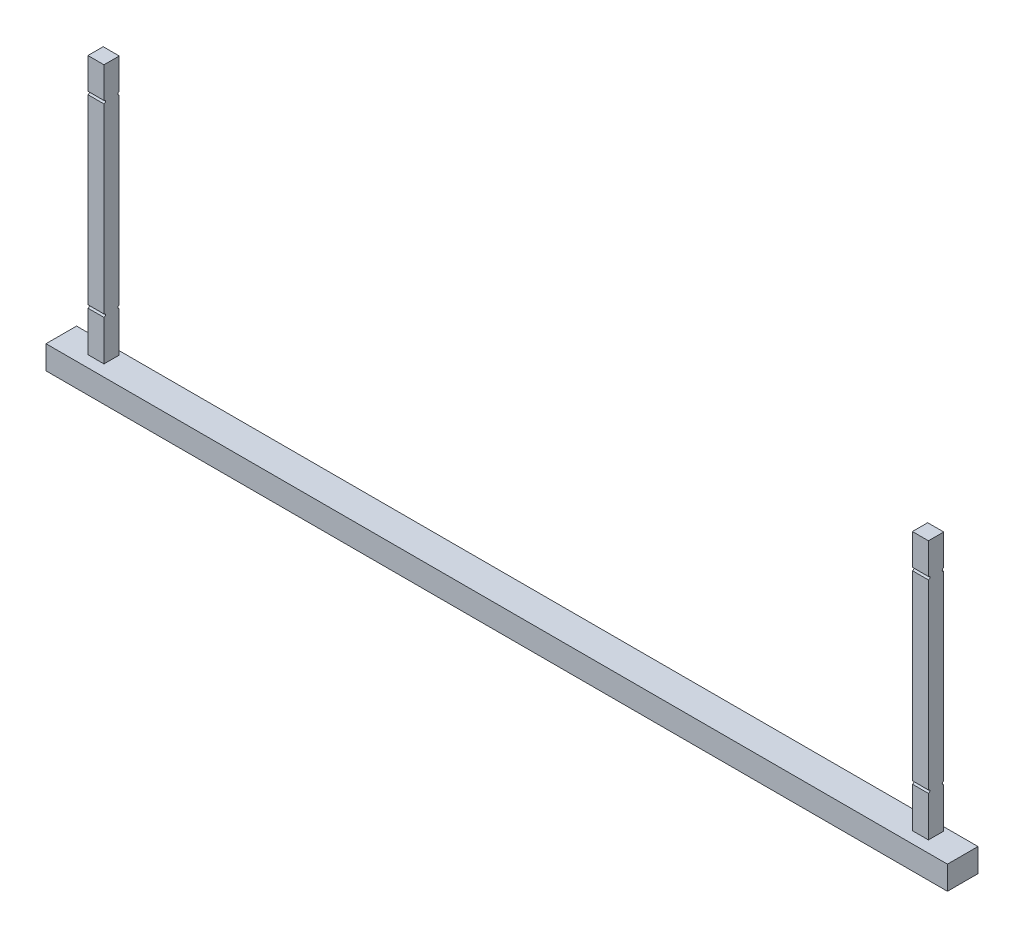
ISO-10303-21;
HEADER;
FILE_DESCRIPTION(('STEP AP214'),'2;1');
FILE_NAME('part.step','',(''),(''),'','','');
FILE_SCHEMA(('AUTOMOTIVE_DESIGN { 1 0 10303 214 1 1 1 1 }'));
ENDSEC;
DATA;
#1=APPLICATION_CONTEXT('core data for automotive mechanical design processes');
#2=APPLICATION_PROTOCOL_DEFINITION('international standard','automotive_design',2000,#1);
#3=PRODUCT_CONTEXT('',#1,'mechanical');
#4=PRODUCT('Part','Part','',(#3));
#5=PRODUCT_RELATED_PRODUCT_CATEGORY('part','',(#4));
#6=PRODUCT_DEFINITION_FORMATION('','',#4);
#7=PRODUCT_DEFINITION_CONTEXT('part definition',#1,'design');
#8=PRODUCT_DEFINITION('design','',#6,#7);
#9=PRODUCT_DEFINITION_SHAPE('','',#8);
#10=(LENGTH_UNIT() NAMED_UNIT(*) SI_UNIT(.MILLI.,.METRE.));
#11=(NAMED_UNIT(*) PLANE_ANGLE_UNIT() SI_UNIT($,.RADIAN.));
#12=(NAMED_UNIT(*) SI_UNIT($,.STERADIAN.) SOLID_ANGLE_UNIT());
#13=UNCERTAINTY_MEASURE_WITH_UNIT(LENGTH_MEASURE(1.E-05),#10,'distance_accuracy_value','');
#14=(GEOMETRIC_REPRESENTATION_CONTEXT(3) GLOBAL_UNCERTAINTY_ASSIGNED_CONTEXT((#13)) GLOBAL_UNIT_ASSIGNED_CONTEXT((#10,
#11,#12)) REPRESENTATION_CONTEXT('',''));
#15=CARTESIAN_POINT('',(0.,0.,0.));
#16=DIRECTION('',(0.,0.,1.));
#17=DIRECTION('',(1.,0.,0.));
#18=AXIS2_PLACEMENT_3D('',#15,#16,#17);
#19=CARTESIAN_POINT('',(5700.63,1849.72,125.));
#20=DIRECTION('',(0.,0.,-1.));
#21=DIRECTION('',(-1.,0.,0.));
#22=AXIS2_PLACEMENT_3D('',#19,#20,#21);
#23=PLANE('',#22);
#24=DIRECTION('',(0.,-1.,0.));
#25=VECTOR('',#24,1.);
#26=CARTESIAN_POINT('',(5595.63,1849.72,125.));
#27=LINE('',#26,#25);
#28=CARTESIAN_POINT('',(5595.63,1849.72,125.));
#29=VERTEX_POINT('',#28);
#30=CARTESIAN_POINT('',(5595.63,1647.29,125.));
#31=VERTEX_POINT('',#30);
#32=EDGE_CURVE('E235',#29,#31,#27,.T.);
#33=ORIENTED_EDGE('',*,*,#32,.T.);
#34=DIRECTION('',(1.,0.,0.));
#35=VECTOR('',#34,1.);
#36=CARTESIAN_POINT('',(5700.63,1647.29,125.));
#37=LINE('',#36,#35);
#38=CARTESIAN_POINT('',(5700.63,1647.29,125.));
#39=VERTEX_POINT('',#38);
#40=EDGE_CURVE('E221',#31,#39,#37,.T.);
#41=ORIENTED_EDGE('',*,*,#40,.T.);
#42=DIRECTION('',(0.,-1.,0.));
#43=VECTOR('',#42,1.);
#44=CARTESIAN_POINT('',(5700.63,1849.72,125.));
#45=LINE('',#44,#43);
#46=CARTESIAN_POINT('',(5700.63,1849.72,125.));
#47=VERTEX_POINT('',#46);
#48=EDGE_CURVE('E232',#47,#39,#45,.T.);
#49=ORIENTED_EDGE('',*,*,#48,.F.);
#50=DIRECTION('',(1.,0.,0.));
#51=VECTOR('',#50,1.);
#52=CARTESIAN_POINT('',(5700.63,1849.72,125.));
#53=LINE('',#52,#51);
#54=EDGE_CURVE('E265',#29,#47,#53,.T.);
#55=ORIENTED_EDGE('',*,*,#54,.F.);
#56=EDGE_LOOP('',(#33,#41,#49,#55));
#57=FACE_BOUND('',#56,.T.);
#58=ADVANCED_FACE('F37',(#57),#23,.F.);
#59=CARTESIAN_POINT('',(199.376102892229,1849.72,125.));
#60=DIRECTION('',(0.,0.,-1.));
#61=DIRECTION('',(-1.,0.,0.));
#62=AXIS2_PLACEMENT_3D('',#59,#60,#61);
#63=PLANE('',#62);
#64=DIRECTION('',(0.,-1.,0.));
#65=VECTOR('',#64,1.);
#66=CARTESIAN_POINT('',(199.376102892229,1849.72,125.));
#67=LINE('',#66,#65);
#68=CARTESIAN_POINT('',(199.376102892229,1849.72,125.));
#69=VERTEX_POINT('',#68);
#70=CARTESIAN_POINT('',(199.376102892229,1647.29,125.));
#71=VERTEX_POINT('',#70);
#72=EDGE_CURVE('E286',#69,#71,#67,.T.);
#73=ORIENTED_EDGE('',*,*,#72,.T.);
#74=DIRECTION('',(1.,0.,0.));
#75=VECTOR('',#74,1.);
#76=CARTESIAN_POINT('',(5700.63,1647.29,125.));
#77=LINE('',#76,#75);
#78=CARTESIAN_POINT('',(304.376102892229,1647.29,125.));
#79=VERTEX_POINT('',#78);
#80=EDGE_CURVE('E60',#71,#79,#77,.T.);
#81=ORIENTED_EDGE('',*,*,#80,.T.);
#82=DIRECTION('',(0.,-1.,0.));
#83=VECTOR('',#82,1.);
#84=CARTESIAN_POINT('',(304.376102892229,1849.72,125.));
#85=LINE('',#84,#83);
#86=CARTESIAN_POINT('',(304.376102892229,1849.72,125.));
#87=VERTEX_POINT('',#86);
#88=EDGE_CURVE('E291',#87,#79,#85,.T.);
#89=ORIENTED_EDGE('',*,*,#88,.F.);
#90=DIRECTION('',(1.,0.,0.));
#91=VECTOR('',#90,1.);
#92=CARTESIAN_POINT('',(199.376102892229,1849.72,125.));
#93=LINE('',#92,#91);
#94=EDGE_CURVE('E310',#69,#87,#93,.T.);
#95=ORIENTED_EDGE('',*,*,#94,.F.);
#96=EDGE_LOOP('',(#73,#81,#89,#95));
#97=FACE_BOUND('',#96,.T.);
#98=ADVANCED_FACE('F429',(#97),#63,.F.);
#99=CARTESIAN_POINT('',(5595.63,1849.72,25.));
#100=DIRECTION('',(0.,0.,1.));
#101=DIRECTION('',(1.,0.,0.));
#102=AXIS2_PLACEMENT_3D('',#99,#100,#101);
#103=PLANE('',#102);
#104=DIRECTION('',(0.,-1.,0.));
#105=VECTOR('',#104,1.);
#106=CARTESIAN_POINT('',(5595.63,1849.72,25.));
#107=LINE('',#106,#105);
#108=CARTESIAN_POINT('',(5595.63,1627.79,25.));
#109=VERTEX_POINT('',#108);
#110=CARTESIAN_POINT('',(5595.63,437.289999999999,25.));
#111=VERTEX_POINT('',#110);
#112=EDGE_CURVE('E509',#109,#111,#107,.T.);
#113=ORIENTED_EDGE('',*,*,#112,.F.);
#114=DIRECTION('',(1.,0.,0.));
#115=VECTOR('',#114,1.);
#116=CARTESIAN_POINT('',(5700.63,1627.79,25.));
#117=LINE('',#116,#115);
#118=CARTESIAN_POINT('',(5700.63,1627.79,25.));
#119=VERTEX_POINT('',#118);
#120=EDGE_CURVE('E353',#109,#119,#117,.T.);
#121=ORIENTED_EDGE('',*,*,#120,.T.);
#122=DIRECTION('',(0.,-1.,0.));
#123=VECTOR('',#122,1.);
#124=CARTESIAN_POINT('',(5700.63,1849.72,25.));
#125=LINE('',#124,#123);
#126=CARTESIAN_POINT('',(5700.63,437.289999999999,25.));
#127=VERTEX_POINT('',#126);
#128=EDGE_CURVE('E254',#119,#127,#125,.T.);
#129=ORIENTED_EDGE('',*,*,#128,.T.);
#130=DIRECTION('',(1.,0.,0.));
#131=VECTOR('',#130,1.);
#132=CARTESIAN_POINT('',(5700.63,437.289999999999,25.));
#133=LINE('',#132,#131);
#134=EDGE_CURVE('E470',#127,#111,#133,.F.);
#135=ORIENTED_EDGE('',*,*,#134,.T.);
#136=EDGE_LOOP('',(#113,#121,#129,#135));
#137=FACE_BOUND('',#136,.T.);
#138=ADVANCED_FACE('F436',(#137),#103,.F.);
#139=CARTESIAN_POINT('',(199.376102892229,1849.72,25.));
#140=DIRECTION('',(0.,0.,1.));
#141=DIRECTION('',(1.,0.,0.));
#142=AXIS2_PLACEMENT_3D('',#139,#140,#141);
#143=PLANE('',#142);
#144=DIRECTION('',(0.,-1.,0.));
#145=VECTOR('',#144,1.);
#146=CARTESIAN_POINT('',(199.376102892229,1849.72,25.));
#147=LINE('',#146,#145);
#148=CARTESIAN_POINT('',(199.376102892229,1627.79,25.0000000000002));
#149=VERTEX_POINT('',#148);
#150=CARTESIAN_POINT('',(199.376102892229,437.289999999999,25.));
#151=VERTEX_POINT('',#150);
#152=EDGE_CURVE('E304',#149,#151,#147,.T.);
#153=ORIENTED_EDGE('',*,*,#152,.F.);
#154=DIRECTION('',(1.,0.,0.));
#155=VECTOR('',#154,1.);
#156=CARTESIAN_POINT('',(5700.63,1627.79,25.0000000000002));
#157=LINE('',#156,#155);
#158=CARTESIAN_POINT('',(304.376102892229,1627.79,25.));
#159=VERTEX_POINT('',#158);
#160=EDGE_CURVE('E364',#149,#159,#157,.T.);
#161=ORIENTED_EDGE('',*,*,#160,.T.);
#162=DIRECTION('',(0.,-1.,0.));
#163=VECTOR('',#162,1.);
#164=CARTESIAN_POINT('',(304.376102892229,1849.72,25.));
#165=LINE('',#164,#163);
#166=CARTESIAN_POINT('',(304.376102892229,437.289999999999,25.0000000000002));
#167=VERTEX_POINT('',#166);
#168=EDGE_CURVE('E299',#159,#167,#165,.T.);
#169=ORIENTED_EDGE('',*,*,#168,.T.);
#170=DIRECTION('',(1.,0.,0.));
#171=VECTOR('',#170,1.);
#172=CARTESIAN_POINT('',(5700.63,437.289999999999,25.0000000000002));
#173=LINE('',#172,#171);
#174=EDGE_CURVE('E324',#167,#151,#173,.F.);
#175=ORIENTED_EDGE('',*,*,#174,.T.);
#176=EDGE_LOOP('',(#153,#161,#169,#175));
#177=FACE_BOUND('',#176,.T.);
#178=ADVANCED_FACE('F405',(#177),#143,.F.);
#179=CARTESIAN_POINT('',(5700.63,1627.79,125.));
#180=VERTEX_POINT('',#179);
#181=CARTESIAN_POINT('',(5700.63,437.289999999999,125.));
#182=VERTEX_POINT('',#181);
#183=EDGE_CURVE('E242',#180,#182,#45,.T.);
#184=ORIENTED_EDGE('',*,*,#183,.F.);
#185=DIRECTION('',(1.,0.,0.));
#186=VECTOR('',#185,1.);
#187=CARTESIAN_POINT('',(5700.63,1627.79,125.));
#188=LINE('',#187,#186);
#189=CARTESIAN_POINT('',(5595.63,1627.79,125.));
#190=VERTEX_POINT('',#189);
#191=EDGE_CURVE('E52',#180,#190,#188,.F.);
#192=ORIENTED_EDGE('',*,*,#191,.T.);
#193=CARTESIAN_POINT('',(5595.63,437.289999999999,125.));
#194=VERTEX_POINT('',#193);
#195=EDGE_CURVE('E245',#190,#194,#27,.T.);
#196=ORIENTED_EDGE('',*,*,#195,.T.);
#197=DIRECTION('',(1.,0.,0.));
#198=VECTOR('',#197,1.);
#199=CARTESIAN_POINT('',(5700.63,437.289999999999,125.));
#200=LINE('',#199,#198);
#201=EDGE_CURVE('E344',#194,#182,#200,.T.);
#202=ORIENTED_EDGE('',*,*,#201,.T.);
#203=EDGE_LOOP('',(#184,#192,#196,#202));
#204=FACE_BOUND('',#203,.T.);
#205=ADVANCED_FACE('F431',(#204),#23,.F.);
#206=CARTESIAN_POINT('',(304.376102892229,1627.79,125.));
#207=VERTEX_POINT('',#206);
#208=CARTESIAN_POINT('',(304.376102892229,437.289999999999,125.));
#209=VERTEX_POINT('',#208);
#210=EDGE_CURVE('E294',#207,#209,#85,.T.);
#211=ORIENTED_EDGE('',*,*,#210,.F.);
#212=DIRECTION('',(1.,0.,0.));
#213=VECTOR('',#212,1.);
#214=CARTESIAN_POINT('',(5700.63,1627.79,125.));
#215=LINE('',#214,#213);
#216=CARTESIAN_POINT('',(199.376102892229,1627.79,125.));
#217=VERTEX_POINT('',#216);
#218=EDGE_CURVE('E226',#207,#217,#215,.F.);
#219=ORIENTED_EDGE('',*,*,#218,.T.);
#220=CARTESIAN_POINT('',(199.376102892229,437.289999999999,125.));
#221=VERTEX_POINT('',#220);
#222=EDGE_CURVE('E289',#217,#221,#67,.T.);
#223=ORIENTED_EDGE('',*,*,#222,.T.);
#224=DIRECTION('',(1.,0.,0.));
#225=VECTOR('',#224,1.);
#226=CARTESIAN_POINT('',(5700.63,437.289999999999,125.));
#227=LINE('',#226,#225);
#228=EDGE_CURVE('E332',#221,#209,#227,.T.);
#229=ORIENTED_EDGE('',*,*,#228,.T.);
#230=EDGE_LOOP('',(#211,#219,#223,#229));
#231=FACE_BOUND('',#230,.T.);
#232=ADVANCED_FACE('F382',(#231),#63,.F.);
#233=CARTESIAN_POINT('',(199.376102892229,417.790000000001,25.0000000000002));
#234=VERTEX_POINT('',#233);
#235=CARTESIAN_POINT('',(199.376102892229,154.,25.));
#236=VERTEX_POINT('',#235);
#237=EDGE_CURVE('E305',#234,#236,#147,.T.);
#238=ORIENTED_EDGE('',*,*,#237,.F.);
#239=DIRECTION('',(1.,0.,0.));
#240=VECTOR('',#239,1.);
#241=CARTESIAN_POINT('',(5700.63,417.790000000001,25.0000000000002));
#242=LINE('',#241,#240);
#243=CARTESIAN_POINT('',(304.376102892229,417.790000000001,25.));
#244=VERTEX_POINT('',#243);
#245=EDGE_CURVE('E318',#234,#244,#242,.T.);
#246=ORIENTED_EDGE('',*,*,#245,.T.);
#247=CARTESIAN_POINT('',(304.376102892229,154.,25.));
#248=VERTEX_POINT('',#247);
#249=EDGE_CURVE('E300',#244,#248,#165,.T.);
#250=ORIENTED_EDGE('',*,*,#249,.T.);
#251=DIRECTION('',(-1.,0.,0.));
#252=VECTOR('',#251,1.);
#253=CARTESIAN_POINT('',(0.,154.,25.));
#254=LINE('',#253,#252);
#255=EDGE_CURVE('E283',#248,#236,#254,.T.);
#256=ORIENTED_EDGE('',*,*,#255,.T.);
#257=EDGE_LOOP('',(#238,#246,#250,#256));
#258=FACE_BOUND('',#257,.T.);
#259=ADVANCED_FACE('F410',(#258),#143,.F.);
#260=CARTESIAN_POINT('',(5595.63,417.790000000001,25.));
#261=VERTEX_POINT('',#260);
#262=CARTESIAN_POINT('',(5595.63,154.,25.));
#263=VERTEX_POINT('',#262);
#264=EDGE_CURVE('E511',#261,#263,#107,.T.);
#265=ORIENTED_EDGE('',*,*,#264,.F.);
#266=DIRECTION('',(1.,0.,0.));
#267=VECTOR('',#266,1.);
#268=CARTESIAN_POINT('',(5700.63,417.790000000001,25.));
#269=LINE('',#268,#267);
#270=CARTESIAN_POINT('',(5700.63,417.790000000001,25.));
#271=VERTEX_POINT('',#270);
#272=EDGE_CURVE('E473',#261,#271,#269,.T.);
#273=ORIENTED_EDGE('',*,*,#272,.T.);
#274=CARTESIAN_POINT('',(5700.63,154.,25.));
#275=VERTEX_POINT('',#274);
#276=EDGE_CURVE('E255',#271,#275,#125,.T.);
#277=ORIENTED_EDGE('',*,*,#276,.T.);
#278=DIRECTION('',(-1.,0.,0.));
#279=VECTOR('',#278,1.);
#280=CARTESIAN_POINT('',(0.,154.,25.));
#281=LINE('',#280,#279);
#282=EDGE_CURVE('E463',#275,#263,#281,.T.);
#283=ORIENTED_EDGE('',*,*,#282,.T.);
#284=EDGE_LOOP('',(#265,#273,#277,#283));
#285=FACE_BOUND('',#284,.T.);
#286=ADVANCED_FACE('F520',(#285),#103,.F.);
#287=CARTESIAN_POINT('',(0.,154.,200.));
#288=DIRECTION('',(0.,-1.,0.));
#289=DIRECTION('',(0.,0.,-1.));
#290=AXIS2_PLACEMENT_3D('',#287,#288,#289);
#291=PLANE('',#290);
#292=ORIENTED_EDGE('',*,*,#282,.F.);
#293=DIRECTION('',(0.,0.,-1.));
#294=VECTOR('',#293,1.);
#295=CARTESIAN_POINT('',(5700.63,154.,200.000000000051));
#296=LINE('',#295,#294);
#297=CARTESIAN_POINT('',(5700.63,154.,125.));
#298=VERTEX_POINT('',#297);
#299=EDGE_CURVE('E461',#298,#275,#296,.T.);
#300=ORIENTED_EDGE('',*,*,#299,.F.);
#301=DIRECTION('',(1.,0.,0.));
#302=VECTOR('',#301,1.);
#303=CARTESIAN_POINT('',(0.,154.,124.999999999999));
#304=LINE('',#303,#302);
#305=CARTESIAN_POINT('',(5595.63,154.,125.));
#306=VERTEX_POINT('',#305);
#307=EDGE_CURVE('E456',#306,#298,#304,.T.);
#308=ORIENTED_EDGE('',*,*,#307,.F.);
#309=DIRECTION('',(0.,0.,1.));
#310=VECTOR('',#309,1.);
#311=CARTESIAN_POINT('',(5595.63,154.,200.));
#312=LINE('',#311,#310);
#313=EDGE_CURVE('E460',#263,#306,#312,.T.);
#314=ORIENTED_EDGE('',*,*,#313,.F.);
#315=EDGE_LOOP('',(#292,#300,#308,#314));
#316=FACE_BOUND('',#315,.T.);
#317=DIRECTION('',(-1.,0.,0.));
#318=VECTOR('',#317,1.);
#319=CARTESIAN_POINT('',(0.,154.,0.));
#320=LINE('',#319,#318);
#321=CARTESIAN_POINT('',(5900.,154.,0.));
#322=VERTEX_POINT('',#321);
#323=CARTESIAN_POINT('',(0.,154.,0.));
#324=VERTEX_POINT('',#323);
#325=EDGE_CURVE('E750',#322,#324,#320,.T.);
#326=ORIENTED_EDGE('',*,*,#325,.T.);
#327=DIRECTION('',(0.,0.,-1.));
#328=VECTOR('',#327,1.);
#329=CARTESIAN_POINT('',(0.,154.,200.));
#330=LINE('',#329,#328);
#331=CARTESIAN_POINT('',(0.,154.,200.));
#332=VERTEX_POINT('',#331);
#333=EDGE_CURVE('E747',#332,#324,#330,.T.);
#334=ORIENTED_EDGE('',*,*,#333,.F.);
#335=DIRECTION('',(-1.,0.,0.));
#336=VECTOR('',#335,1.);
#337=CARTESIAN_POINT('',(0.,154.,200.));
#338=LINE('',#337,#336);
#339=CARTESIAN_POINT('',(5900.,154.,200.));
#340=VERTEX_POINT('',#339);
#341=EDGE_CURVE('E764',#340,#332,#338,.T.);
#342=ORIENTED_EDGE('',*,*,#341,.F.);
#343=DIRECTION('',(0.,0.,-1.));
#344=VECTOR('',#343,1.);
#345=CARTESIAN_POINT('',(5900.,154.,200.));
#346=LINE('',#345,#344);
#347=EDGE_CURVE('E758',#340,#322,#346,.T.);
#348=ORIENTED_EDGE('',*,*,#347,.T.);
#349=EDGE_LOOP('',(#326,#334,#342,#348));
#350=FACE_BOUND('',#349,.T.);
#351=DIRECTION('',(0.,0.,1.));
#352=VECTOR('',#351,1.);
#353=CARTESIAN_POINT('',(199.376102892229,154.,200.));
#354=LINE('',#353,#352);
#355=CARTESIAN_POINT('',(199.376102892229,154.,125.));
#356=VERTEX_POINT('',#355);
#357=EDGE_CURVE('E274',#236,#356,#354,.T.);
#358=ORIENTED_EDGE('',*,*,#357,.F.);
#359=ORIENTED_EDGE('',*,*,#255,.F.);
#360=DIRECTION('',(0.,0.,-1.));
#361=VECTOR('',#360,1.);
#362=CARTESIAN_POINT('',(304.376102892229,154.,200.));
#363=LINE('',#362,#361);
#364=CARTESIAN_POINT('',(304.376102892229,154.,125.));
#365=VERTEX_POINT('',#364);
#366=EDGE_CURVE('E280',#365,#248,#363,.T.);
#367=ORIENTED_EDGE('',*,*,#366,.F.);
#368=DIRECTION('',(1.,0.,0.));
#369=VECTOR('',#368,1.);
#370=CARTESIAN_POINT('',(0.,154.,125.));
#371=LINE('',#370,#369);
#372=EDGE_CURVE('E277',#356,#365,#371,.T.);
#373=ORIENTED_EDGE('',*,*,#372,.F.);
#374=EDGE_LOOP('',(#358,#359,#367,#373));
#375=FACE_BOUND('',#374,.T.);
#376=ADVANCED_FACE('F395',(#316,#350,#375),#291,.F.);
#377=CARTESIAN_POINT('',(0.,0.,200.));
#378=DIRECTION('',(1.,0.,0.));
#379=DIRECTION('',(0.,0.,-1.));
#380=AXIS2_PLACEMENT_3D('',#377,#378,#379);
#381=PLANE('',#380);
#382=DIRECTION('',(0.,-1.,0.));
#383=VECTOR('',#382,1.);
#384=CARTESIAN_POINT('',(0.,0.,0.));
#385=LINE('',#384,#383);
#386=CARTESIAN_POINT('',(0.,0.,0.));
#387=VERTEX_POINT('',#386);
#388=EDGE_CURVE('E508',#324,#387,#385,.T.);
#389=ORIENTED_EDGE('',*,*,#388,.T.);
#390=DIRECTION('',(0.,0.,-1.));
#391=VECTOR('',#390,1.);
#392=CARTESIAN_POINT('',(0.,0.,200.));
#393=LINE('',#392,#391);
#394=CARTESIAN_POINT('',(0.,0.,200.));
#395=VERTEX_POINT('',#394);
#396=EDGE_CURVE('E465',#395,#387,#393,.T.);
#397=ORIENTED_EDGE('',*,*,#396,.F.);
#398=DIRECTION('',(0.,-1.,0.));
#399=VECTOR('',#398,1.);
#400=CARTESIAN_POINT('',(0.,0.,200.));
#401=LINE('',#400,#399);
#402=EDGE_CURVE('E766',#332,#395,#401,.T.);
#403=ORIENTED_EDGE('',*,*,#402,.F.);
#404=ORIENTED_EDGE('',*,*,#333,.T.);
#405=EDGE_LOOP('',(#389,#397,#403,#404));
#406=FACE_BOUND('',#405,.T.);
#407=ADVANCED_FACE('F39',(#406),#381,.F.);
#408=CARTESIAN_POINT('',(0.,0.,200.));
#409=DIRECTION('',(0.,1.,0.));
#410=DIRECTION('',(0.,0.,1.));
#411=AXIS2_PLACEMENT_3D('',#408,#409,#410);
#412=PLANE('',#411);
#413=DIRECTION('',(1.,0.,0.));
#414=VECTOR('',#413,1.);
#415=CARTESIAN_POINT('',(0.,0.,0.));
#416=LINE('',#415,#414);
#417=CARTESIAN_POINT('',(5900.,0.,0.));
#418=VERTEX_POINT('',#417);
#419=EDGE_CURVE('E513',#387,#418,#416,.T.);
#420=ORIENTED_EDGE('',*,*,#419,.T.);
#421=DIRECTION('',(0.,0.,-1.));
#422=VECTOR('',#421,1.);
#423=CARTESIAN_POINT('',(5900.,0.,200.));
#424=LINE('',#423,#422);
#425=CARTESIAN_POINT('',(5900.,0.,200.));
#426=VERTEX_POINT('',#425);
#427=EDGE_CURVE('E757',#426,#418,#424,.T.);
#428=ORIENTED_EDGE('',*,*,#427,.F.);
#429=DIRECTION('',(1.,0.,0.));
#430=VECTOR('',#429,1.);
#431=CARTESIAN_POINT('',(0.,0.,200.));
#432=LINE('',#431,#430);
#433=EDGE_CURVE('E755',#395,#426,#432,.T.);
#434=ORIENTED_EDGE('',*,*,#433,.F.);
#435=ORIENTED_EDGE('',*,*,#396,.T.);
#436=EDGE_LOOP('',(#420,#428,#434,#435));
#437=FACE_BOUND('',#436,.T.);
#438=ADVANCED_FACE('F691',(#437),#412,.F.);
#439=CARTESIAN_POINT('',(5900.,154.,200.));
#440=DIRECTION('',(-1.,0.,0.));
#441=DIRECTION('',(0.,0.,1.));
#442=AXIS2_PLACEMENT_3D('',#439,#440,#441);
#443=PLANE('',#442);
#444=DIRECTION('',(0.,1.,0.));
#445=VECTOR('',#444,1.);
#446=CARTESIAN_POINT('',(5900.,154.,0.));
#447=LINE('',#446,#445);
#448=EDGE_CURVE('E751',#418,#322,#447,.T.);
#449=ORIENTED_EDGE('',*,*,#448,.T.);
#450=ORIENTED_EDGE('',*,*,#347,.F.);
#451=DIRECTION('',(0.,1.,0.));
#452=VECTOR('',#451,1.);
#453=CARTESIAN_POINT('',(5900.,154.,200.));
#454=LINE('',#453,#452);
#455=EDGE_CURVE('E769',#426,#340,#454,.T.);
#456=ORIENTED_EDGE('',*,*,#455,.F.);
#457=ORIENTED_EDGE('',*,*,#427,.T.);
#458=EDGE_LOOP('',(#449,#450,#456,#457));
#459=FACE_BOUND('',#458,.T.);
#460=ADVANCED_FACE('F696',(#459),#443,.F.);
#461=CARTESIAN_POINT('',(0.,0.,200.));
#462=DIRECTION('',(0.,0.,-1.));
#463=DIRECTION('',(-1.,0.,0.));
#464=AXIS2_PLACEMENT_3D('',#461,#462,#463);
#465=PLANE('',#464);
#466=ORIENTED_EDGE('',*,*,#402,.T.);
#467=ORIENTED_EDGE('',*,*,#433,.T.);
#468=ORIENTED_EDGE('',*,*,#455,.T.);
#469=ORIENTED_EDGE('',*,*,#341,.T.);
#470=EDGE_LOOP('',(#466,#467,#468,#469));
#471=FACE_BOUND('',#470,.T.);
#472=ADVANCED_FACE('F714',(#471),#465,.F.);
#473=CARTESIAN_POINT('',(0.,0.,0.));
#474=DIRECTION('',(0.,0.,-1.));
#475=DIRECTION('',(-1.,0.,0.));
#476=AXIS2_PLACEMENT_3D('',#473,#474,#475);
#477=PLANE('',#476);
#478=ORIENTED_EDGE('',*,*,#388,.F.);
#479=ORIENTED_EDGE('',*,*,#325,.F.);
#480=ORIENTED_EDGE('',*,*,#448,.F.);
#481=ORIENTED_EDGE('',*,*,#419,.F.);
#482=EDGE_LOOP('',(#478,#479,#480,#481));
#483=FACE_BOUND('',#482,.T.);
#484=ADVANCED_FACE('F596',(#483),#477,.T.);
#485=CARTESIAN_POINT('',(5700.63,1849.72,25.));
#486=VERTEX_POINT('',#485);
#487=CARTESIAN_POINT('',(5700.63,1647.29,25.));
#488=VERTEX_POINT('',#487);
#489=EDGE_CURVE('E248',#486,#488,#125,.T.);
#490=ORIENTED_EDGE('',*,*,#489,.T.);
#491=DIRECTION('',(1.,0.,0.));
#492=VECTOR('',#491,1.);
#493=CARTESIAN_POINT('',(5700.63,1647.29,25.));
#494=LINE('',#493,#492);
#495=CARTESIAN_POINT('',(5595.63,1647.29,25.));
#496=VERTEX_POINT('',#495);
#497=EDGE_CURVE('E359',#488,#496,#494,.F.);
#498=ORIENTED_EDGE('',*,*,#497,.T.);
#499=CARTESIAN_POINT('',(5595.63,1849.72,25.));
#500=VERTEX_POINT('',#499);
#501=EDGE_CURVE('E507',#500,#496,#107,.T.);
#502=ORIENTED_EDGE('',*,*,#501,.F.);
#503=DIRECTION('',(-1.,0.,0.));
#504=VECTOR('',#503,1.);
#505=CARTESIAN_POINT('',(5595.63,1849.72,25.));
#506=LINE('',#505,#504);
#507=EDGE_CURVE('E272',#486,#500,#506,.T.);
#508=ORIENTED_EDGE('',*,*,#507,.F.);
#509=EDGE_LOOP('',(#490,#498,#502,#508));
#510=FACE_BOUND('',#509,.T.);
#511=ADVANCED_FACE('F451',(#510),#103,.F.);
#512=CARTESIAN_POINT('',(5595.63,1849.72,125.));
#513=DIRECTION('',(1.,0.,0.));
#514=DIRECTION('',(0.,0.,-1.));
#515=AXIS2_PLACEMENT_3D('',#512,#513,#514);
#516=PLANE('',#515);
#517=ORIENTED_EDGE('',*,*,#195,.F.);
#518=CARTESIAN_POINT('',(5595.63,1637.54,125.));
#519=DIRECTION('',(1.,0.,0.));
#520=DIRECTION('',(0.,0.,-1.));
#521=AXIS2_PLACEMENT_3D('',#518,#519,#520);
#522=CIRCLE('',#521,9.74999999999893);
#523=EDGE_CURVE('E372',#190,#31,#522,.T.);
#524=ORIENTED_EDGE('',*,*,#523,.T.);
#525=ORIENTED_EDGE('',*,*,#32,.F.);
#526=DIRECTION('',(0.,0.,1.));
#527=VECTOR('',#526,1.);
#528=CARTESIAN_POINT('',(5595.63,1849.72,125.));
#529=LINE('',#528,#527);
#530=EDGE_CURVE('E268',#500,#29,#529,.T.);
#531=ORIENTED_EDGE('',*,*,#530,.F.);
#532=ORIENTED_EDGE('',*,*,#501,.T.);
#533=CARTESIAN_POINT('',(5595.63,1637.54,25.));
#534=DIRECTION('',(1.,0.,0.));
#535=DIRECTION('',(0.,0.,-1.));
#536=AXIS2_PLACEMENT_3D('',#533,#534,#535);
#537=CIRCLE('',#536,9.74999999999893);
#538=EDGE_CURVE('E356',#496,#109,#537,.T.);
#539=ORIENTED_EDGE('',*,*,#538,.T.);
#540=ORIENTED_EDGE('',*,*,#112,.T.);
#541=CARTESIAN_POINT('',(5595.63,427.54,25.));
#542=DIRECTION('',(1.,0.,0.));
#543=DIRECTION('',(0.,0.,-1.));
#544=AXIS2_PLACEMENT_3D('',#541,#542,#543);
#545=CIRCLE('',#544,9.74999999999895);
#546=EDGE_CURVE('E327',#111,#261,#545,.T.);
#547=ORIENTED_EDGE('',*,*,#546,.T.);
#548=ORIENTED_EDGE('',*,*,#264,.T.);
#549=ORIENTED_EDGE('',*,*,#313,.T.);
#550=CARTESIAN_POINT('',(5595.63,417.790000000001,125.));
#551=VERTEX_POINT('',#550);
#552=EDGE_CURVE('E241',#551,#306,#27,.T.);
#553=ORIENTED_EDGE('',*,*,#552,.F.);
#554=CARTESIAN_POINT('',(5595.63,427.54,125.));
#555=DIRECTION('',(1.,0.,0.));
#556=DIRECTION('',(0.,0.,-1.));
#557=AXIS2_PLACEMENT_3D('',#554,#555,#556);
#558=CIRCLE('',#557,9.74999999999895);
#559=EDGE_CURVE('E475',#551,#194,#558,.T.);
#560=ORIENTED_EDGE('',*,*,#559,.T.);
#561=EDGE_LOOP('',(#517,#524,#525,#531,#532,#539,#540,#547,#548,#549,#553,#560));
#562=FACE_BOUND('',#561,.T.);
#563=ADVANCED_FACE('F444',(#562),#516,.F.);
#564=CARTESIAN_POINT('',(5700.63,417.790000000001,125.));
#565=VERTEX_POINT('',#564);
#566=EDGE_CURVE('E244',#565,#298,#45,.T.);
#567=ORIENTED_EDGE('',*,*,#566,.F.);
#568=DIRECTION('',(1.,0.,0.));
#569=VECTOR('',#568,1.);
#570=CARTESIAN_POINT('',(5700.63,417.790000000001,125.));
#571=LINE('',#570,#569);
#572=EDGE_CURVE('E347',#565,#551,#571,.F.);
#573=ORIENTED_EDGE('',*,*,#572,.T.);
#574=ORIENTED_EDGE('',*,*,#552,.T.);
#575=ORIENTED_EDGE('',*,*,#307,.T.);
#576=EDGE_LOOP('',(#567,#573,#574,#575));
#577=FACE_BOUND('',#576,.T.);
#578=ADVANCED_FACE('F432',(#577),#23,.F.);
#579=CARTESIAN_POINT('',(5700.63,1849.72,25.));
#580=DIRECTION('',(-1.,0.,0.));
#581=DIRECTION('',(0.,0.,1.));
#582=AXIS2_PLACEMENT_3D('',#579,#580,#581);
#583=PLANE('',#582);
#584=ORIENTED_EDGE('',*,*,#48,.T.);
#585=CARTESIAN_POINT('',(5700.63,1637.54,125.));
#586=DIRECTION('',(1.,0.,0.));
#587=DIRECTION('',(0.,0.,-1.));
#588=AXIS2_PLACEMENT_3D('',#585,#586,#587);
#589=CIRCLE('',#588,9.74999999999926);
#590=EDGE_CURVE('E218',#180,#39,#589,.T.);
#591=ORIENTED_EDGE('',*,*,#590,.F.);
#592=ORIENTED_EDGE('',*,*,#183,.T.);
#593=CARTESIAN_POINT('',(5700.63,427.54,125.));
#594=DIRECTION('',(1.,0.,0.));
#595=DIRECTION('',(0.,0.,-1.));
#596=AXIS2_PLACEMENT_3D('',#593,#594,#595);
#597=CIRCLE('',#596,9.74999999999931);
#598=EDGE_CURVE('E350',#565,#182,#597,.T.);
#599=ORIENTED_EDGE('',*,*,#598,.F.);
#600=ORIENTED_EDGE('',*,*,#566,.T.);
#601=ORIENTED_EDGE('',*,*,#299,.T.);
#602=ORIENTED_EDGE('',*,*,#276,.F.);
#603=CARTESIAN_POINT('',(5700.63,427.54,25.));
#604=DIRECTION('',(1.,0.,0.));
#605=DIRECTION('',(0.,0.,-1.));
#606=AXIS2_PLACEMENT_3D('',#603,#604,#605);
#607=CIRCLE('',#606,9.74999999999931);
#608=EDGE_CURVE('E330',#127,#271,#607,.T.);
#609=ORIENTED_EDGE('',*,*,#608,.F.);
#610=ORIENTED_EDGE('',*,*,#128,.F.);
#611=CARTESIAN_POINT('',(5700.63,1637.54,25.));
#612=DIRECTION('',(1.,0.,0.));
#613=DIRECTION('',(0.,0.,-1.));
#614=AXIS2_PLACEMENT_3D('',#611,#612,#613);
#615=CIRCLE('',#614,9.74999999999926);
#616=EDGE_CURVE('E236',#488,#119,#615,.T.);
#617=ORIENTED_EDGE('',*,*,#616,.F.);
#618=ORIENTED_EDGE('',*,*,#489,.F.);
#619=DIRECTION('',(0.,0.,-1.));
#620=VECTOR('',#619,1.);
#621=CARTESIAN_POINT('',(5700.63,1849.72,25.));
#622=LINE('',#621,#620);
#623=EDGE_CURVE('E240',#47,#486,#622,.T.);
#624=ORIENTED_EDGE('',*,*,#623,.F.);
#625=EDGE_LOOP('',(#584,#591,#592,#599,#600,#601,#602,#609,#610,#617,#618,#624));
#626=FACE_BOUND('',#625,.T.);
#627=ADVANCED_FACE('F238',(#626),#583,.F.);
#628=CARTESIAN_POINT('',(0.,1849.72,0.));
#629=DIRECTION('',(0.,-1.,0.));
#630=DIRECTION('',(0.,0.,-1.));
#631=AXIS2_PLACEMENT_3D('',#628,#629,#630);
#632=PLANE('',#631);
#633=ORIENTED_EDGE('',*,*,#507,.T.);
#634=ORIENTED_EDGE('',*,*,#530,.T.);
#635=ORIENTED_EDGE('',*,*,#54,.T.);
#636=ORIENTED_EDGE('',*,*,#623,.T.);
#637=EDGE_LOOP('',(#633,#634,#635,#636));
#638=FACE_BOUND('',#637,.T.);
#639=ADVANCED_FACE('F450',(#638),#632,.F.);
#640=CARTESIAN_POINT('',(199.376102892229,1849.72,25.));
#641=DIRECTION('',(1.,0.,0.));
#642=DIRECTION('',(0.,0.,-1.));
#643=AXIS2_PLACEMENT_3D('',#640,#641,#642);
#644=PLANE('',#643);
#645=ORIENTED_EDGE('',*,*,#222,.F.);
#646=CARTESIAN_POINT('',(199.376102892229,1637.54,125.));
#647=DIRECTION('',(1.,0.,0.));
#648=DIRECTION('',(0.,0.,-1.));
#649=AXIS2_PLACEMENT_3D('',#646,#647,#648);
#650=CIRCLE('',#649,9.74999999999893);
#651=EDGE_CURVE('E11',#217,#71,#650,.T.);
#652=ORIENTED_EDGE('',*,*,#651,.T.);
#653=ORIENTED_EDGE('',*,*,#72,.F.);
#654=DIRECTION('',(0.,0.,1.));
#655=VECTOR('',#654,1.);
#656=CARTESIAN_POINT('',(199.376102892229,1849.72,25.));
#657=LINE('',#656,#655);
#658=CARTESIAN_POINT('',(199.376102892229,1849.72,25.));
#659=VERTEX_POINT('',#658);
#660=EDGE_CURVE('E312',#659,#69,#657,.T.);
#661=ORIENTED_EDGE('',*,*,#660,.F.);
#662=CARTESIAN_POINT('',(199.376102892229,1647.29,25.0000000000002));
#663=VERTEX_POINT('',#662);
#664=EDGE_CURVE('E301',#659,#663,#147,.T.);
#665=ORIENTED_EDGE('',*,*,#664,.T.);
#666=CARTESIAN_POINT('',(199.376102892229,1637.54,25.));
#667=DIRECTION('',(1.,0.,0.));
#668=DIRECTION('',(0.,0.,-1.));
#669=AXIS2_PLACEMENT_3D('',#666,#667,#668);
#670=CIRCLE('',#669,9.74999999999893);
#671=EDGE_CURVE('E361',#663,#149,#670,.T.);
#672=ORIENTED_EDGE('',*,*,#671,.T.);
#673=ORIENTED_EDGE('',*,*,#152,.T.);
#674=CARTESIAN_POINT('',(199.376102892229,427.54,25.));
#675=DIRECTION('',(1.,0.,0.));
#676=DIRECTION('',(0.,0.,-1.));
#677=AXIS2_PLACEMENT_3D('',#674,#675,#676);
#678=CIRCLE('',#677,9.74999999999895);
#679=EDGE_CURVE('E315',#151,#234,#678,.T.);
#680=ORIENTED_EDGE('',*,*,#679,.T.);
#681=ORIENTED_EDGE('',*,*,#237,.T.);
#682=ORIENTED_EDGE('',*,*,#357,.T.);
#683=CARTESIAN_POINT('',(199.376102892229,417.790000000001,125.));
#684=VERTEX_POINT('',#683);
#685=EDGE_CURVE('E290',#684,#356,#67,.T.);
#686=ORIENTED_EDGE('',*,*,#685,.F.);
#687=CARTESIAN_POINT('',(199.376102892229,427.54,125.));
#688=DIRECTION('',(1.,0.,0.));
#689=DIRECTION('',(0.,0.,-1.));
#690=AXIS2_PLACEMENT_3D('',#687,#688,#689);
#691=CIRCLE('',#690,9.74999999999895);
#692=EDGE_CURVE('E335',#684,#221,#691,.T.);
#693=ORIENTED_EDGE('',*,*,#692,.T.);
#694=EDGE_LOOP('',(#645,#652,#653,#661,#665,#672,#673,#680,#681,#682,#686,#693));
#695=FACE_BOUND('',#694,.T.);
#696=ADVANCED_FACE('F385',(#695),#644,.F.);
#697=CARTESIAN_POINT('',(304.376102892229,417.790000000001,125.));
#698=VERTEX_POINT('',#697);
#699=EDGE_CURVE('E295',#698,#365,#85,.T.);
#700=ORIENTED_EDGE('',*,*,#699,.F.);
#701=DIRECTION('',(1.,0.,0.));
#702=VECTOR('',#701,1.);
#703=CARTESIAN_POINT('',(5700.63,417.790000000001,125.));
#704=LINE('',#703,#702);
#705=EDGE_CURVE('E341',#698,#684,#704,.F.);
#706=ORIENTED_EDGE('',*,*,#705,.T.);
#707=ORIENTED_EDGE('',*,*,#685,.T.);
#708=ORIENTED_EDGE('',*,*,#372,.T.);
#709=EDGE_LOOP('',(#700,#706,#707,#708));
#710=FACE_BOUND('',#709,.T.);
#711=ADVANCED_FACE('F391',(#710),#63,.F.);
#712=CARTESIAN_POINT('',(304.376102892229,1849.72,25.));
#713=DIRECTION('',(-1.,0.,0.));
#714=DIRECTION('',(0.,0.,1.));
#715=AXIS2_PLACEMENT_3D('',#712,#713,#714);
#716=PLANE('',#715);
#717=ORIENTED_EDGE('',*,*,#88,.T.);
#718=CARTESIAN_POINT('',(304.376102892229,1637.54,125.));
#719=DIRECTION('',(-1.,0.,0.));
#720=DIRECTION('',(0.,0.,1.));
#721=AXIS2_PLACEMENT_3D('',#718,#719,#720);
#722=CIRCLE('',#721,9.74999999999893);
#723=EDGE_CURVE('E375',#79,#207,#722,.T.);
#724=ORIENTED_EDGE('',*,*,#723,.T.);
#725=ORIENTED_EDGE('',*,*,#210,.T.);
#726=CARTESIAN_POINT('',(304.376102892229,427.54,125.));
#727=DIRECTION('',(-1.,0.,0.));
#728=DIRECTION('',(0.,0.,1.));
#729=AXIS2_PLACEMENT_3D('',#726,#727,#728);
#730=CIRCLE('',#729,9.74999999999895);
#731=EDGE_CURVE('E338',#209,#698,#730,.T.);
#732=ORIENTED_EDGE('',*,*,#731,.T.);
#733=ORIENTED_EDGE('',*,*,#699,.T.);
#734=ORIENTED_EDGE('',*,*,#366,.T.);
#735=ORIENTED_EDGE('',*,*,#249,.F.);
#736=CARTESIAN_POINT('',(304.376102892229,427.54,25.));
#737=DIRECTION('',(-1.,0.,0.));
#738=DIRECTION('',(0.,0.,1.));
#739=AXIS2_PLACEMENT_3D('',#736,#737,#738);
#740=CIRCLE('',#739,9.74999999999895);
#741=EDGE_CURVE('E321',#244,#167,#740,.T.);
#742=ORIENTED_EDGE('',*,*,#741,.T.);
#743=ORIENTED_EDGE('',*,*,#168,.F.);
#744=CARTESIAN_POINT('',(304.376102892229,1637.54,25.));
#745=DIRECTION('',(-1.,0.,0.));
#746=DIRECTION('',(0.,0.,1.));
#747=AXIS2_PLACEMENT_3D('',#744,#745,#746);
#748=CIRCLE('',#747,9.74999999999893);
#749=CARTESIAN_POINT('',(304.376102892229,1647.29,25.));
#750=VERTEX_POINT('',#749);
#751=EDGE_CURVE('E45',#159,#750,#748,.T.);
#752=ORIENTED_EDGE('',*,*,#751,.T.);
#753=CARTESIAN_POINT('',(304.376102892229,1849.72,25.));
#754=VERTEX_POINT('',#753);
#755=EDGE_CURVE('E296',#754,#750,#165,.T.);
#756=ORIENTED_EDGE('',*,*,#755,.F.);
#757=DIRECTION('',(0.,0.,-1.));
#758=VECTOR('',#757,1.);
#759=CARTESIAN_POINT('',(304.376102892229,1849.72,25.));
#760=LINE('',#759,#758);
#761=EDGE_CURVE('E308',#87,#754,#760,.T.);
#762=ORIENTED_EDGE('',*,*,#761,.F.);
#763=EDGE_LOOP('',(#717,#724,#725,#732,#733,#734,#735,#742,#743,#752,#756,#762));
#764=FACE_BOUND('',#763,.T.);
#765=ADVANCED_FACE('F411',(#764),#716,.F.);
#766=ORIENTED_EDGE('',*,*,#755,.T.);
#767=DIRECTION('',(1.,0.,0.));
#768=VECTOR('',#767,1.);
#769=CARTESIAN_POINT('',(5700.63,1647.29,25.0000000000002));
#770=LINE('',#769,#768);
#771=EDGE_CURVE('E367',#750,#663,#770,.F.);
#772=ORIENTED_EDGE('',*,*,#771,.T.);
#773=ORIENTED_EDGE('',*,*,#664,.F.);
#774=DIRECTION('',(-1.,0.,0.));
#775=VECTOR('',#774,1.);
#776=CARTESIAN_POINT('',(199.376102892229,1849.72,25.));
#777=LINE('',#776,#775);
#778=EDGE_CURVE('E306',#754,#659,#777,.T.);
#779=ORIENTED_EDGE('',*,*,#778,.F.);
#780=EDGE_LOOP('',(#766,#772,#773,#779));
#781=FACE_BOUND('',#780,.T.);
#782=ADVANCED_FACE('F481',(#781),#143,.F.);
#783=CARTESIAN_POINT('',(0.,1849.72,0.));
#784=DIRECTION('',(0.,1.,0.));
#785=DIRECTION('',(0.,0.,1.));
#786=AXIS2_PLACEMENT_3D('',#783,#784,#785);
#787=PLANE('',#786);
#788=ORIENTED_EDGE('',*,*,#660,.T.);
#789=ORIENTED_EDGE('',*,*,#94,.T.);
#790=ORIENTED_EDGE('',*,*,#761,.T.);
#791=ORIENTED_EDGE('',*,*,#778,.T.);
#792=EDGE_LOOP('',(#788,#789,#790,#791));
#793=FACE_BOUND('',#792,.T.);
#794=ADVANCED_FACE('F485',(#793),#787,.T.);
#795=CARTESIAN_POINT('',(5700.63,427.54,25.));
#796=DIRECTION('',(1.,0.,0.));
#797=DIRECTION('',(0.,0.,-1.));
#798=AXIS2_PLACEMENT_3D('',#795,#796,#797);
#799=CYLINDRICAL_SURFACE('',#798,9.74999999999895);
#800=ORIENTED_EDGE('',*,*,#546,.F.);
#801=ORIENTED_EDGE('',*,*,#134,.F.);
#802=ORIENTED_EDGE('',*,*,#608,.T.);
#803=ORIENTED_EDGE('',*,*,#272,.F.);
#804=EDGE_LOOP('',(#800,#801,#802,#803));
#805=FACE_BOUND('',#804,.T.);
#806=ADVANCED_FACE('F488',(#805),#799,.F.);
#807=ORIENTED_EDGE('',*,*,#174,.F.);
#808=ORIENTED_EDGE('',*,*,#741,.F.);
#809=ORIENTED_EDGE('',*,*,#245,.F.);
#810=ORIENTED_EDGE('',*,*,#679,.F.);
#811=EDGE_LOOP('',(#807,#808,#809,#810));
#812=FACE_BOUND('',#811,.T.);
#813=ADVANCED_FACE('F404',(#812),#799,.F.);
#814=CARTESIAN_POINT('',(5700.63,427.54,125.));
#815=DIRECTION('',(1.,0.,0.));
#816=DIRECTION('',(0.,0.,-1.));
#817=AXIS2_PLACEMENT_3D('',#814,#815,#816);
#818=CYLINDRICAL_SURFACE('',#817,9.74999999999895);
#819=ORIENTED_EDGE('',*,*,#559,.F.);
#820=ORIENTED_EDGE('',*,*,#572,.F.);
#821=ORIENTED_EDGE('',*,*,#598,.T.);
#822=ORIENTED_EDGE('',*,*,#201,.F.);
#823=EDGE_LOOP('',(#819,#820,#821,#822));
#824=FACE_BOUND('',#823,.T.);
#825=ADVANCED_FACE('F417',(#824),#818,.F.);
#826=ORIENTED_EDGE('',*,*,#692,.F.);
#827=ORIENTED_EDGE('',*,*,#705,.F.);
#828=ORIENTED_EDGE('',*,*,#731,.F.);
#829=ORIENTED_EDGE('',*,*,#228,.F.);
#830=EDGE_LOOP('',(#826,#827,#828,#829));
#831=FACE_BOUND('',#830,.T.);
#832=ADVANCED_FACE('F414',(#831),#818,.F.);
#833=CARTESIAN_POINT('',(5700.63,1637.54,25.));
#834=DIRECTION('',(1.,0.,0.));
#835=DIRECTION('',(0.,0.,-1.));
#836=AXIS2_PLACEMENT_3D('',#833,#834,#835);
#837=CYLINDRICAL_SURFACE('',#836,9.74999999999893);
#838=ORIENTED_EDGE('',*,*,#771,.F.);
#839=ORIENTED_EDGE('',*,*,#751,.F.);
#840=ORIENTED_EDGE('',*,*,#160,.F.);
#841=ORIENTED_EDGE('',*,*,#671,.F.);
#842=EDGE_LOOP('',(#838,#839,#840,#841));
#843=FACE_BOUND('',#842,.T.);
#844=ADVANCED_FACE('F416',(#843),#837,.F.);
#845=ORIENTED_EDGE('',*,*,#538,.F.);
#846=ORIENTED_EDGE('',*,*,#497,.F.);
#847=ORIENTED_EDGE('',*,*,#616,.T.);
#848=ORIENTED_EDGE('',*,*,#120,.F.);
#849=EDGE_LOOP('',(#845,#846,#847,#848));
#850=FACE_BOUND('',#849,.T.);
#851=ADVANCED_FACE('F423',(#850),#837,.F.);
#852=CARTESIAN_POINT('',(5700.63,1637.54,125.));
#853=DIRECTION('',(1.,0.,0.));
#854=DIRECTION('',(0.,0.,-1.));
#855=AXIS2_PLACEMENT_3D('',#852,#853,#854);
#856=CYLINDRICAL_SURFACE('',#855,9.74999999999893);
#857=ORIENTED_EDGE('',*,*,#651,.F.);
#858=ORIENTED_EDGE('',*,*,#218,.F.);
#859=ORIENTED_EDGE('',*,*,#723,.F.);
#860=ORIENTED_EDGE('',*,*,#80,.F.);
#861=EDGE_LOOP('',(#857,#858,#859,#860));
#862=FACE_BOUND('',#861,.T.);
#863=ADVANCED_FACE('F530',(#862),#856,.F.);
#864=ORIENTED_EDGE('',*,*,#523,.F.);
#865=ORIENTED_EDGE('',*,*,#191,.F.);
#866=ORIENTED_EDGE('',*,*,#590,.T.);
#867=ORIENTED_EDGE('',*,*,#40,.F.);
#868=EDGE_LOOP('',(#864,#865,#866,#867));
#869=FACE_BOUND('',#868,.T.);
#870=ADVANCED_FACE('F220',(#869),#856,.F.);
#871=CLOSED_SHELL('',(#58,#98,#138,#178,#205,#232,#259,#286,#376,#407,#438,#460,#472,#484,#511,
#563,#578,#627,#639,#696,#711,#765,#782,#794,#806,#813,#825,#832,#844,#851,#863,#870));
#872=MANIFOLD_SOLID_BREP('B2',#871);
#873=ADVANCED_BREP_SHAPE_REPRESENTATION('',(#18,#872),#14);
#874=SHAPE_DEFINITION_REPRESENTATION(#9,#873);
ENDSEC;
END-ISO-10303-21;
